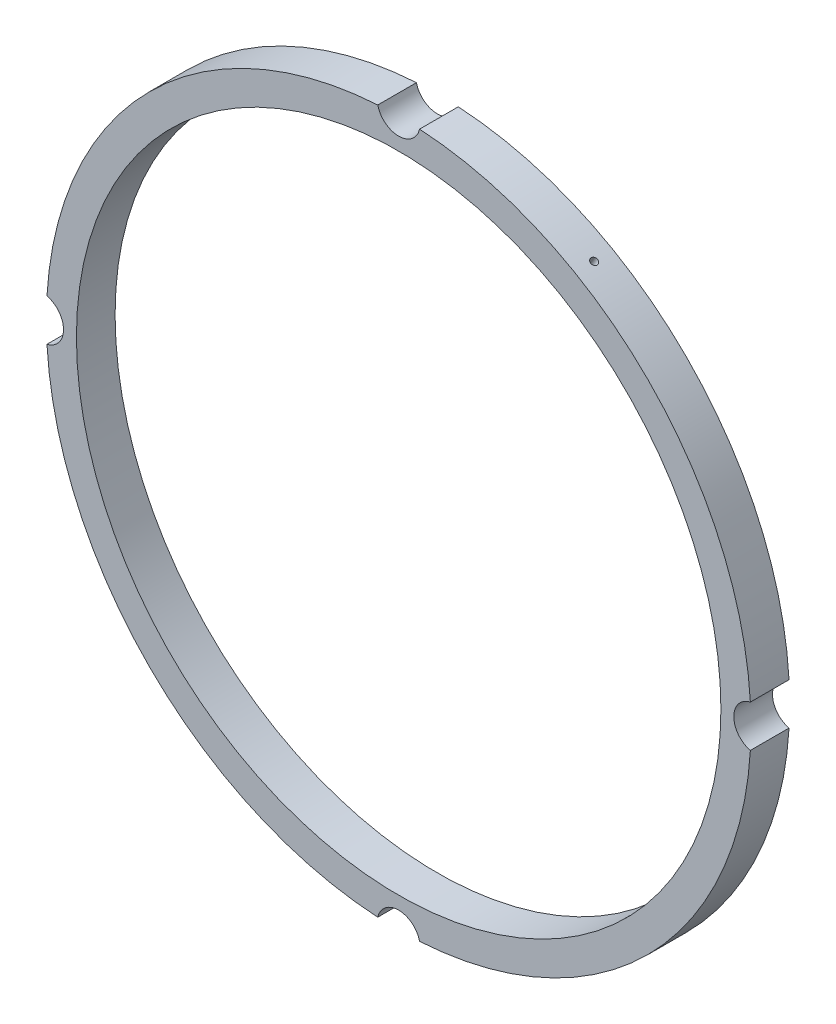
ISO-10303-21;
HEADER;
FILE_DESCRIPTION(('STEP AP214'),'2;1');
FILE_NAME('part.step','',(''),(''),'','','');
FILE_SCHEMA(('AUTOMOTIVE_DESIGN { 1 0 10303 214 1 1 1 1 }'));
ENDSEC;
DATA;
#1=APPLICATION_CONTEXT('core data for automotive mechanical design processes');
#2=APPLICATION_PROTOCOL_DEFINITION('international standard','automotive_design',2000,#1);
#3=PRODUCT_CONTEXT('',#1,'mechanical');
#4=PRODUCT('Part','Part','',(#3));
#5=PRODUCT_RELATED_PRODUCT_CATEGORY('part','',(#4));
#6=PRODUCT_DEFINITION_FORMATION('','',#4);
#7=PRODUCT_DEFINITION_CONTEXT('part definition',#1,'design');
#8=PRODUCT_DEFINITION('design','',#6,#7);
#9=PRODUCT_DEFINITION_SHAPE('','',#8);
#10=(LENGTH_UNIT() NAMED_UNIT(*) SI_UNIT(.MILLI.,.METRE.));
#11=(NAMED_UNIT(*) PLANE_ANGLE_UNIT() SI_UNIT($,.RADIAN.));
#12=(NAMED_UNIT(*) SI_UNIT($,.STERADIAN.) SOLID_ANGLE_UNIT());
#13=UNCERTAINTY_MEASURE_WITH_UNIT(LENGTH_MEASURE(1.E-05),#10,'distance_accuracy_value','');
#14=(GEOMETRIC_REPRESENTATION_CONTEXT(3) GLOBAL_UNCERTAINTY_ASSIGNED_CONTEXT((#13)) GLOBAL_UNIT_ASSIGNED_CONTEXT((#10,
#11,#12)) REPRESENTATION_CONTEXT('',''));
#15=CARTESIAN_POINT('',(0.,0.,0.));
#16=DIRECTION('',(0.,0.,1.));
#17=DIRECTION('',(1.,0.,0.));
#18=AXIS2_PLACEMENT_3D('',#15,#16,#17);
#19=CARTESIAN_POINT('',(0.,0.,9.));
#20=DIRECTION('',(0.,0.,-1.));
#21=DIRECTION('',(-1.,0.,0.));
#22=AXIS2_PLACEMENT_3D('',#19,#20,#21);
#23=CYLINDRICAL_SURFACE('',#22,82.);
#24=CARTESIAN_POINT('',(0.,0.,0.));
#25=DIRECTION('',(0.,0.,1.));
#26=DIRECTION('',(1.,0.,0.));
#27=AXIS2_PLACEMENT_3D('',#24,#25,#26);
#28=CIRCLE('',#27,82.);
#29=CARTESIAN_POINT('',(-4.86723129559619,81.855421686747,0.));
#30=VERTEX_POINT('',#29);
#31=CARTESIAN_POINT('',(-81.8554216867469,4.86723129559705,0.));
#32=VERTEX_POINT('',#31);
#33=EDGE_CURVE('E123',#30,#32,#28,.T.);
#34=ORIENTED_EDGE('',*,*,#33,.T.);
#35=DIRECTION('',(0.,0.,1.));
#36=VECTOR('',#35,1.);
#37=CARTESIAN_POINT('',(-81.8554216867469,4.86723129559704,4.5));
#38=LINE('',#37,#36);
#39=CARTESIAN_POINT('',(-81.8554216867469,4.86723129559704,9.));
#40=VERTEX_POINT('',#39);
#41=EDGE_CURVE('E56',#32,#40,#38,.T.);
#42=ORIENTED_EDGE('',*,*,#41,.T.);
#43=CARTESIAN_POINT('',(0.,0.,9.));
#44=DIRECTION('',(0.,0.,1.));
#45=DIRECTION('',(1.,0.,0.));
#46=AXIS2_PLACEMENT_3D('',#43,#44,#45);
#47=CIRCLE('',#46,82.);
#48=CARTESIAN_POINT('',(-4.86723129559619,81.855421686747,9.));
#49=VERTEX_POINT('',#48);
#50=EDGE_CURVE('E130',#49,#40,#47,.T.);
#51=ORIENTED_EDGE('',*,*,#50,.F.);
#52=DIRECTION('',(0.,0.,1.));
#53=VECTOR('',#52,1.);
#54=CARTESIAN_POINT('',(-4.86723129559619,81.855421686747,4.5));
#55=LINE('',#54,#53);
#56=EDGE_CURVE('E132',#49,#30,#55,.F.);
#57=ORIENTED_EDGE('',*,*,#56,.T.);
#58=EDGE_LOOP('',(#34,#42,#51,#57));
#59=FACE_BOUND('',#58,.T.);
#60=ADVANCED_FACE('F37',(#59),#23,.T.);
#61=CARTESIAN_POINT('',(-81.8554216867471,-4.86723129559533,9.));
#62=VERTEX_POINT('',#61);
#63=CARTESIAN_POINT('',(-4.86723129559619,-81.855421686747,9.));
#64=VERTEX_POINT('',#63);
#65=EDGE_CURVE('E116',#62,#64,#47,.T.);
#66=ORIENTED_EDGE('',*,*,#65,.F.);
#67=DIRECTION('',(0.,0.,1.));
#68=VECTOR('',#67,1.);
#69=CARTESIAN_POINT('',(-81.8554216867471,-4.86723129559533,4.5));
#70=LINE('',#69,#68);
#71=CARTESIAN_POINT('',(-81.8554216867471,-4.86723129559533,0.));
#72=VERTEX_POINT('',#71);
#73=EDGE_CURVE('E107',#62,#72,#70,.F.);
#74=ORIENTED_EDGE('',*,*,#73,.T.);
#75=CARTESIAN_POINT('',(-4.86723129559619,-81.855421686747,0.));
#76=VERTEX_POINT('',#75);
#77=EDGE_CURVE('E64',#72,#76,#28,.T.);
#78=ORIENTED_EDGE('',*,*,#77,.T.);
#79=DIRECTION('',(0.,0.,1.));
#80=VECTOR('',#79,1.);
#81=CARTESIAN_POINT('',(-4.86723129559619,-81.855421686747,4.5));
#82=LINE('',#81,#80);
#83=EDGE_CURVE('E161',#76,#64,#82,.T.);
#84=ORIENTED_EDGE('',*,*,#83,.T.);
#85=EDGE_LOOP('',(#66,#74,#78,#84));
#86=FACE_BOUND('',#85,.T.);
#87=ADVANCED_FACE('F115',(#86),#23,.T.);
#88=CARTESIAN_POINT('',(4.86723129559619,-81.855421686747,9.));
#89=VERTEX_POINT('',#88);
#90=CARTESIAN_POINT('',(81.855421686747,-4.86723129559647,9.));
#91=VERTEX_POINT('',#90);
#92=EDGE_CURVE('E146',#89,#91,#47,.T.);
#93=ORIENTED_EDGE('',*,*,#92,.F.);
#94=DIRECTION('',(0.,0.,1.));
#95=VECTOR('',#94,1.);
#96=CARTESIAN_POINT('',(4.86723129559619,-81.855421686747,4.5));
#97=LINE('',#96,#95);
#98=CARTESIAN_POINT('',(4.86723129559619,-81.855421686747,0.));
#99=VERTEX_POINT('',#98);
#100=EDGE_CURVE('E214',#89,#99,#97,.F.);
#101=ORIENTED_EDGE('',*,*,#100,.T.);
#102=CARTESIAN_POINT('',(81.855421686747,-4.86723129559647,0.));
#103=VERTEX_POINT('',#102);
#104=EDGE_CURVE('E124',#99,#103,#28,.T.);
#105=ORIENTED_EDGE('',*,*,#104,.T.);
#106=DIRECTION('',(0.,0.,1.));
#107=VECTOR('',#106,1.);
#108=CARTESIAN_POINT('',(81.855421686747,-4.86723129559647,4.5));
#109=LINE('',#108,#107);
#110=EDGE_CURVE('E49',#103,#91,#109,.T.);
#111=ORIENTED_EDGE('',*,*,#110,.T.);
#112=EDGE_LOOP('',(#93,#101,#105,#111));
#113=FACE_BOUND('',#112,.T.);
#114=ADVANCED_FACE('F144',(#113),#23,.T.);
#115=CARTESIAN_POINT('',(0.,0.,9.));
#116=DIRECTION('',(0.,0.,1.));
#117=DIRECTION('',(1.,0.,0.));
#118=AXIS2_PLACEMENT_3D('',#115,#116,#117);
#119=PLANE('',#118);
#120=CARTESIAN_POINT('',(-83.,8.6937885337194E-13,9.));
#121=DIRECTION('',(0.,0.,1.));
#122=DIRECTION('',(0.,1.,0.));
#123=AXIS2_PLACEMENT_3D('',#120,#121,#122);
#124=CIRCLE('',#123,5.);
#125=EDGE_CURVE('E112',#62,#40,#124,.T.);
#126=ORIENTED_EDGE('',*,*,#125,.F.);
#127=ORIENTED_EDGE('',*,*,#65,.T.);
#128=CARTESIAN_POINT('',(0.,-83.,9.));
#129=DIRECTION('',(0.,0.,1.));
#130=DIRECTION('',(-1.,0.,0.));
#131=AXIS2_PLACEMENT_3D('',#128,#129,#130);
#132=CIRCLE('',#131,5.);
#133=EDGE_CURVE('E206',#89,#64,#132,.T.);
#134=ORIENTED_EDGE('',*,*,#133,.F.);
#135=ORIENTED_EDGE('',*,*,#92,.T.);
#136=CARTESIAN_POINT('',(83.,-2.8979295112398E-13,9.));
#137=DIRECTION('',(0.,0.,1.));
#138=DIRECTION('',(0.,-1.,0.));
#139=AXIS2_PLACEMENT_3D('',#136,#137,#138);
#140=CIRCLE('',#139,5.);
#141=CARTESIAN_POINT('',(81.855421686747,4.8672312955959,9.));
#142=VERTEX_POINT('',#141);
#143=EDGE_CURVE('E153',#142,#91,#140,.T.);
#144=ORIENTED_EDGE('',*,*,#143,.F.);
#145=CARTESIAN_POINT('',(4.86723129559619,81.855421686747,9.));
#146=VERTEX_POINT('',#145);
#147=EDGE_CURVE('E126',#142,#146,#47,.T.);
#148=ORIENTED_EDGE('',*,*,#147,.T.);
#149=CARTESIAN_POINT('',(0.,83.,9.));
#150=DIRECTION('',(0.,0.,1.));
#151=DIRECTION('',(1.,0.,0.));
#152=AXIS2_PLACEMENT_3D('',#149,#150,#151);
#153=CIRCLE('',#152,5.);
#154=EDGE_CURVE('E156',#49,#146,#153,.T.);
#155=ORIENTED_EDGE('',*,*,#154,.F.);
#156=ORIENTED_EDGE('',*,*,#50,.T.);
#157=EDGE_LOOP('',(#126,#127,#134,#135,#144,#148,#155,#156));
#158=FACE_BOUND('',#157,.T.);
#159=CARTESIAN_POINT('',(0.,0.,9.));
#160=DIRECTION('',(0.,0.,1.));
#161=DIRECTION('',(1.,0.,0.));
#162=AXIS2_PLACEMENT_3D('',#159,#160,#161);
#163=CIRCLE('',#162,75.);
#164=CARTESIAN_POINT('',(75.,0.,9.));
#165=VERTEX_POINT('',#164);
#166=EDGE_CURVE('E168',#165,#165,#163,.T.);
#167=ORIENTED_EDGE('',*,*,#166,.F.);
#168=EDGE_LOOP('',(#167));
#169=FACE_BOUND('',#168,.T.);
#170=ADVANCED_FACE('F202',(#158,#169),#119,.T.);
#171=CARTESIAN_POINT('',(0.,0.,0.));
#172=DIRECTION('',(0.,0.,1.));
#173=DIRECTION('',(1.,0.,0.));
#174=AXIS2_PLACEMENT_3D('',#171,#172,#173);
#175=PLANE('',#174);
#176=ORIENTED_EDGE('',*,*,#77,.F.);
#177=CARTESIAN_POINT('',(-83.,8.6937885337194E-13,0.));
#178=DIRECTION('',(0.,0.,1.));
#179=DIRECTION('',(0.,1.,0.));
#180=AXIS2_PLACEMENT_3D('',#177,#178,#179);
#181=CIRCLE('',#180,5.);
#182=EDGE_CURVE('E105',#72,#32,#181,.T.);
#183=ORIENTED_EDGE('',*,*,#182,.T.);
#184=ORIENTED_EDGE('',*,*,#33,.F.);
#185=CARTESIAN_POINT('',(0.,83.,0.));
#186=DIRECTION('',(0.,0.,1.));
#187=DIRECTION('',(1.,0.,0.));
#188=AXIS2_PLACEMENT_3D('',#185,#186,#187);
#189=CIRCLE('',#188,5.);
#190=CARTESIAN_POINT('',(4.86723129559619,81.855421686747,0.));
#191=VERTEX_POINT('',#190);
#192=EDGE_CURVE('E159',#30,#191,#189,.T.);
#193=ORIENTED_EDGE('',*,*,#192,.T.);
#194=CARTESIAN_POINT('',(81.855421686747,4.8672312955959,0.));
#195=VERTEX_POINT('',#194);
#196=EDGE_CURVE('E127',#195,#191,#28,.T.);
#197=ORIENTED_EDGE('',*,*,#196,.F.);
#198=CARTESIAN_POINT('',(83.,-2.8979295112398E-13,0.));
#199=DIRECTION('',(0.,0.,1.));
#200=DIRECTION('',(0.,-1.,0.));
#201=AXIS2_PLACEMENT_3D('',#198,#199,#200);
#202=CIRCLE('',#201,5.);
#203=EDGE_CURVE('E151',#195,#103,#202,.T.);
#204=ORIENTED_EDGE('',*,*,#203,.T.);
#205=ORIENTED_EDGE('',*,*,#104,.F.);
#206=CARTESIAN_POINT('',(0.,-83.,0.));
#207=DIRECTION('',(0.,0.,1.));
#208=DIRECTION('',(-1.,0.,0.));
#209=AXIS2_PLACEMENT_3D('',#206,#207,#208);
#210=CIRCLE('',#209,5.);
#211=EDGE_CURVE('E122',#99,#76,#210,.T.);
#212=ORIENTED_EDGE('',*,*,#211,.T.);
#213=EDGE_LOOP('',(#176,#183,#184,#193,#197,#204,#205,#212));
#214=FACE_BOUND('',#213,.T.);
#215=CARTESIAN_POINT('',(0.,0.,0.));
#216=DIRECTION('',(0.,0.,1.));
#217=DIRECTION('',(1.,0.,0.));
#218=AXIS2_PLACEMENT_3D('',#215,#216,#217);
#219=CIRCLE('',#218,75.);
#220=CARTESIAN_POINT('',(75.,0.,0.));
#221=VERTEX_POINT('',#220);
#222=EDGE_CURVE('E166',#221,#221,#219,.T.);
#223=ORIENTED_EDGE('',*,*,#222,.T.);
#224=EDGE_LOOP('',(#223));
#225=FACE_BOUND('',#224,.T.);
#226=ADVANCED_FACE('F119',(#214,#225),#175,.F.);
#227=CARTESIAN_POINT('',(40.3052284110281,71.4107034185693,4.5));
#228=CARTESIAN_POINT('',(40.305230162785,71.4107024681233,4.45506479609301));
#229=CARTESIAN_POINT('',(40.3085368078791,71.40883642493,4.41009703714875));
#230=CARTESIAN_POINT('',(40.3216802135916,71.4014156688339,4.32140003350558));
#231=CARTESIAN_POINT('',(40.3315248278901,71.3958565196163,4.2776723443821));
#232=CARTESIAN_POINT('',(40.3574592527584,71.3811999286591,4.19275330768963));
#233=CARTESIAN_POINT('',(40.3735460727166,71.3721041812829,4.1515607564808));
#234=CARTESIAN_POINT('',(40.4114971299767,71.3506227921757,4.07287429083479));
#235=CARTESIAN_POINT('',(40.4333599334488,71.3382379669211,4.03537946164327));
#236=CARTESIAN_POINT('',(40.4822388609424,71.3105120161913,3.96513443541361));
#237=CARTESIAN_POINT('',(40.5092556770344,71.2951704936937,3.93238487660122));
#238=CARTESIAN_POINT('',(40.5676657214676,71.2619507473826,3.87256517048709));
#239=CARTESIAN_POINT('',(40.59905912185,71.2440724238483,3.84549524655357));
#240=CARTESIAN_POINT('',(40.6653214679689,71.2062713712898,3.79780471692709));
#241=CARTESIAN_POINT('',(40.7001904182244,71.1863486396075,3.77718411961991));
#242=CARTESIAN_POINT('',(40.772406334745,71.1450111456782,3.74297779787522));
#243=CARTESIAN_POINT('',(40.8097532955037,71.1235963867468,3.72939205780614));
#244=CARTESIAN_POINT('',(40.8858585322044,71.0798740635081,3.70964144378451));
#245=CARTESIAN_POINT('',(40.9246167652487,71.0575665263361,3.70347634446412));
#246=CARTESIAN_POINT('',(41.0024427076472,71.0126869615936,3.69874133559804));
#247=CARTESIAN_POINT('',(41.0415104163721,70.9901149345609,3.70017141060814));
#248=CARTESIAN_POINT('',(41.1188455717403,70.945348935138,3.71058592631372));
#249=CARTESIAN_POINT('',(41.1571130452983,70.9231549500377,3.71957011251892));
#250=CARTESIAN_POINT('',(41.2317665366884,70.8797805669154,3.7448374350582));
#251=CARTESIAN_POINT('',(41.2681525523058,70.8586001700864,3.76112057998316));
#252=CARTESIAN_POINT('',(41.3380172194721,70.8178647619419,3.80052388209611));
#253=CARTESIAN_POINT('',(41.3714958216182,70.7983097782456,3.82364415543102));
#254=CARTESIAN_POINT('',(41.434603016724,70.7613949232539,3.87606530348475));
#255=CARTESIAN_POINT('',(41.4642316101463,70.7440350516948,3.90536617746084));
#256=CARTESIAN_POINT('',(41.5188083007378,70.7120185025764,3.9693182281911));
#257=CARTESIAN_POINT('',(41.5437562021976,70.6973619380483,4.00396962855131));
#258=CARTESIAN_POINT('',(41.5882710512857,70.6711849340483,4.07763829735254));
#259=CARTESIAN_POINT('',(41.6078379981956,70.6596644949952,4.11665556637643));
#260=CARTESIAN_POINT('',(41.641043626485,70.640100926749,4.19794850712354));
#261=CARTESIAN_POINT('',(41.6546823022913,70.6320578008251,4.24022418191001));
#262=CARTESIAN_POINT('',(41.6756502729947,70.6196879331484,4.3268337992777));
#263=CARTESIAN_POINT('',(41.6829795699621,70.6153611901761,4.37116774118354));
#264=CARTESIAN_POINT('',(41.6911239668386,70.6105530728755,4.46063342804992));
#265=CARTESIAN_POINT('',(41.6919393353669,70.6100715399797,4.50576514003536));
#266=CARTESIAN_POINT('',(41.6870338226723,70.6129677812092,4.59554693556316));
#267=CARTESIAN_POINT('',(41.6813129419862,70.6163455550177,4.64019701914508));
#268=CARTESIAN_POINT('',(41.6634948178797,70.6268596602105,4.72774720890134));
#269=CARTESIAN_POINT('',(41.6513976958952,70.6339959200141,4.77064734838672));
#270=CARTESIAN_POINT('',(41.6211650638207,70.6518147314161,4.8534808607507));
#271=CARTESIAN_POINT('',(41.6030295531477,70.6624972833568,4.89341423334282));
#272=CARTESIAN_POINT('',(41.5612265203059,70.6870924286367,4.96918206255699));
#273=CARTESIAN_POINT('',(41.537558817141,70.7010051276562,5.00501638501377));
#274=CARTESIAN_POINT('',(41.4853544455829,70.7316497769729,5.07156755198845));
#275=CARTESIAN_POINT('',(41.4568177741148,70.7483817290505,5.10228439327472));
#276=CARTESIAN_POINT('',(41.3956750206665,70.7841743762166,5.15772966893016));
#277=CARTESIAN_POINT('',(41.3630688010143,70.8032351500882,5.18245790062276));
#278=CARTESIAN_POINT('',(41.2947046718655,70.8431290267123,5.22522259144113));
#279=CARTESIAN_POINT('',(41.2589467660966,70.8639621273686,5.24325905848161));
#280=CARTESIAN_POINT('',(41.1852880913143,70.9067969831621,5.27212789441348));
#281=CARTESIAN_POINT('',(41.1473873619883,70.9287987166545,5.2829603966825));
#282=CARTESIAN_POINT('',(41.0705139344065,70.9733390629306,5.29711425167829));
#283=CARTESIAN_POINT('',(41.0315412345227,70.9958776765296,5.30043559299621));
#284=CARTESIAN_POINT('',(40.9536306752187,71.0408485140235,5.29947279646204));
#285=CARTESIAN_POINT('',(40.9146928143604,71.0632807424909,5.2951889885238));
#286=CARTESIAN_POINT('',(40.8379572703114,71.1074061241529,5.279138152379));
#287=CARTESIAN_POINT('',(40.8001595894107,71.129099275863,5.26737110914375));
#288=CARTESIAN_POINT('',(40.7267814451327,71.1711392536284,5.23668763250792));
#289=CARTESIAN_POINT('',(40.6912010228659,71.1914860547211,5.21777106659268));
#290=CARTESIAN_POINT('',(40.6232765406942,71.2302669838026,5.17332635454546));
#291=CARTESIAN_POINT('',(40.5909323548439,71.2487011862253,5.14779846584659));
#292=CARTESIAN_POINT('',(40.5304074104666,71.2831487094411,5.09085755066491));
#293=CARTESIAN_POINT('',(40.5022263893502,71.2991621829217,5.05944489564428));
#294=CARTESIAN_POINT('',(40.4508278504761,71.328335198352,4.99161477008843));
#295=CARTESIAN_POINT('',(40.4276115676375,71.3414940302556,4.95519605804873));
#296=CARTESIAN_POINT('',(40.3868099222115,71.3646000206399,4.87838044791628));
#297=CARTESIAN_POINT('',(40.3692273551643,71.3745455846659,4.83798158776967));
#298=CARTESIAN_POINT('',(40.340231691055,71.3909377104108,4.75439747070503));
#299=CARTESIAN_POINT('',(40.3288112020707,71.3973884644812,4.71121562216788));
#300=CARTESIAN_POINT('',(40.3155112248783,71.4048988976244,4.63979902324665));
#301=CARTESIAN_POINT('',(40.3116600520628,71.4070729879977,4.61202827082364));
#302=CARTESIAN_POINT('',(40.3065180975612,71.4099755455663,4.55617592082972));
#303=CARTESIAN_POINT('',(40.3052273157971,71.4107040128057,4.52809432326828));
#304=CARTESIAN_POINT('',(40.3052284110281,71.4107034185693,4.5));
#305=B_SPLINE_CURVE_WITH_KNOTS('',3,(#227,#228,#229,#230,#231,#232,#233,#234,#235,#236,#237,
#238,#239,#240,#241,#242,#243,#244,#245,#246,#247,#248,#249,#250,#251,#252,#253,#254,#255,#256,
#257,#258,#259,#260,#261,#262,#263,#264,#265,#266,#267,#268,#269,#270,#271,#272,#273,#274,#275,
#276,#277,#278,#279,#280,#281,#282,#283,#284,#285,#286,#287,#288,#289,#290,#291,#292,#293,#294,
#295,#296,#297,#298,#299,#300,#301,#302,#303,#304),.UNSPECIFIED.,.T.,.F.,(4,2,2,2,2,2,2,2,2,2,2,
2,2,2,2,2,2,2,2,2,2,2,2,2,2,2,2,2,2,2,2,2,2,2,2,2,2,2,4),(0.,0.134703067123949,
0.269568238553242,0.404368876326949,0.539136082591835,0.673921397882167,0.808712013005293,
0.94350280339,1.07829329426615,1.21307969139774,1.3478658144514,1.4826473968801,
1.61742913794746,1.75221316877516,1.88699718340582,2.02178683237555,2.15657649934034,
2.29136629302324,2.426156042478,2.56094023348925,2.69572441343266,2.83050602649563,
2.96528765257389,3.10007368890393,3.23485981034963,3.36965049281604,3.50444101585779,
3.639229043254,3.77401727538222,3.90879966049609,4.04358231629638,4.1783674703827,
4.31314737696436,4.44791877874285,4.58272366439784,4.71759533917825,4.85230486249334,
4.93652372208243,5.02074257910246),.UNSPECIFIED.);
#306=CARTESIAN_POINT('',(40.3052284110281,71.4107034185693,4.5));
#307=VERTEX_POINT('',#306);
#308=EDGE_CURVE('E11',#307,#307,#305,.T.);
#309=ORIENTED_EDGE('',*,*,#308,.T.);
#310=EDGE_LOOP('',(#309));
#311=FACE_BOUND('',#310,.T.);
#312=ORIENTED_EDGE('',*,*,#147,.F.);
#313=DIRECTION('',(0.,0.,1.));
#314=VECTOR('',#313,1.);
#315=CARTESIAN_POINT('',(81.855421686747,4.8672312955959,4.5));
#316=LINE('',#315,#314);
#317=EDGE_CURVE('E138',#142,#195,#316,.F.);
#318=ORIENTED_EDGE('',*,*,#317,.T.);
#319=ORIENTED_EDGE('',*,*,#196,.T.);
#320=DIRECTION('',(0.,0.,1.));
#321=VECTOR('',#320,1.);
#322=CARTESIAN_POINT('',(4.86723129559619,81.855421686747,4.5));
#323=LINE('',#322,#321);
#324=EDGE_CURVE('E135',#191,#146,#323,.T.);
#325=ORIENTED_EDGE('',*,*,#324,.T.);
#326=EDGE_LOOP('',(#312,#318,#319,#325));
#327=FACE_BOUND('',#326,.T.);
#328=ADVANCED_FACE('F39',(#311,#327),#23,.T.);
#329=CARTESIAN_POINT('',(0.,0.,9.));
#330=DIRECTION('',(0.,0.,-1.));
#331=DIRECTION('',(-1.,0.,0.));
#332=AXIS2_PLACEMENT_3D('',#329,#330,#331);
#333=CYLINDRICAL_SURFACE('',#332,75.);
#334=CARTESIAN_POINT('',(36.8050462829542,65.3482101370007,4.5));
#335=CARTESIAN_POINT('',(36.8050480371068,65.3482091908556,4.4550650202504));
#336=CARTESIAN_POINT('',(36.8083563893281,65.3463461799556,4.41009749094247));
#337=CARTESIAN_POINT('',(36.8215064307599,65.3389372344705,4.32140095562176));
#338=CARTESIAN_POINT('',(36.8313559762903,65.3333868711768,4.2776735049402));
#339=CARTESIAN_POINT('',(36.8573029001601,65.3187526175866,4.19275494634586));
#340=CARTESIAN_POINT('',(36.8733972851322,65.3096704202157,4.15156263419737));
#341=CARTESIAN_POINT('',(36.9113652327449,65.2882193796654,4.07287659923404));
#342=CARTESIAN_POINT('',(36.9332373616623,65.275851351847,4.03538196202201));
#343=CARTESIAN_POINT('',(36.9821357786632,65.2481602840425,3.96513702906339));
#344=CARTESIAN_POINT('',(37.0091627888349,65.2328368300614,3.93238739912278));
#345=CARTESIAN_POINT('',(37.0675928290538,65.1996525164563,3.87256749931847));
#346=CARTESIAN_POINT('',(37.0989960311762,65.1817915570551,3.84549745288538));
#347=CARTESIAN_POINT('',(37.165276621277,65.1440224914367,3.79780653018475));
#348=CARTESIAN_POINT('',(37.2001540272983,65.1241143745878,3.77718568741294));
#349=CARTESIAN_POINT('',(37.2723844475244,65.0828017747338,3.74297889347224));
#350=CARTESIAN_POINT('',(37.309737456126,65.0613972951156,3.7293929263815));
#351=CARTESIAN_POINT('',(37.385851456047,65.0176901750221,3.7096419663105));
#352=CARTESIAN_POINT('',(37.4246123956756,64.9953875675174,3.70347670116969));
#353=CARTESIAN_POINT('',(37.5024403148383,64.9505118372576,3.69874132894007));
#354=CARTESIAN_POINT('',(37.541507293736,64.9279387150649,3.70017120606366));
#355=CARTESIAN_POINT('',(37.6188373554944,64.8831647861721,3.71058526118988));
#356=CARTESIAN_POINT('',(37.6571004707224,64.8609639644887,3.71956913443268));
#357=CARTESIAN_POINT('',(37.7317423544195,64.8175707954564,3.74483569725782));
#358=CARTESIAN_POINT('',(37.7681211206258,64.7963784493184,3.76111839560382));
#359=CARTESIAN_POINT('',(37.8379693340923,64.7556153066755,3.8005207415664));
#360=CARTESIAN_POINT('',(37.8714387220741,64.7360445432105,3.82364052844561));
#361=CARTESIAN_POINT('',(37.934526459754,64.6990961367939,3.87606063773741));
#362=CARTESIAN_POINT('',(37.9641448097006,64.6817184937006,3.90536095975093));
#363=CARTESIAN_POINT('',(38.0187013917973,64.6496662631315,3.96931214094038));
#364=CARTESIAN_POINT('',(38.0436393901331,64.6349918106984,4.00396326726652));
#365=CARTESIAN_POINT('',(38.0881356631969,64.6087810653332,4.07763147675293));
#366=CARTESIAN_POINT('',(38.1076939372037,64.597244772822,4.11664856049856));
#367=CARTESIAN_POINT('',(38.1408844541449,64.5776533045459,4.19794124937333));
#368=CARTESIAN_POINT('',(38.1545166903565,64.5695981327303,4.24021685819907));
#369=CARTESIAN_POINT('',(38.1754747513236,64.5572093338679,4.32682645392057));
#370=CARTESIAN_POINT('',(38.1828005784973,64.5528757053942,4.37116044002703));
#371=CARTESIAN_POINT('',(38.1909413824111,64.5480597632868,4.46062594210085));
#372=CARTESIAN_POINT('',(38.1917566800836,64.5475772598144,4.50575741864649));
#373=CARTESIAN_POINT('',(38.1868545475179,64.5504775161813,4.59553881341012));
#374=CARTESIAN_POINT('',(38.1811371179785,64.5538602756073,4.64018873167963));
#375=CARTESIAN_POINT('',(38.1633291083601,64.5643896994272,4.72773849669129));
#376=CARTESIAN_POINT('',(38.1512386734367,64.5715362780939,4.77063838326932));
#377=CARTESIAN_POINT('',(38.121021943817,64.58937987047,4.85347150366393));
#378=CARTESIAN_POINT('',(38.1028956482698,64.6000768846797,4.89340473706235));
#379=CARTESIAN_POINT('',(38.0611124544012,64.6247035165116,4.96917268708774));
#380=CARTESIAN_POINT('',(38.0374553396379,64.6386332606425,5.00500724323626));
#381=CARTESIAN_POINT('',(37.9852724588776,64.6693125821188,5.07155900623287));
#382=CARTESIAN_POINT('',(37.9567466895903,64.6860621613697,5.10227620962268));
#383=CARTESIAN_POINT('',(37.8956246465006,64.7218887639563,5.15772253126949));
#384=CARTESIAN_POINT('',(37.863028208343,64.7409658812668,5.18245140762659));
#385=CARTESIAN_POINT('',(37.7946816007971,64.7808892105927,5.22521742401462));
#386=CARTESIAN_POINT('',(37.7589314352171,64.8017354204719,5.24325457212629));
#387=CARTESIAN_POINT('',(37.6852854659991,64.8445917012878,5.27212471767835));
#388=CARTESIAN_POINT('',(37.6473897097049,64.8666017465431,5.28295787401225));
#389=CARTESIAN_POINT('',(37.570522798859,64.9111530416104,5.29711304961451));
#390=CARTESIAN_POINT('',(37.5315516427333,64.9336942922,5.30043505788945));
#391=CARTESIAN_POINT('',(37.4536409057876,64.9786642363913,5.29947358692461));
#392=CARTESIAN_POINT('',(37.4147013234452,65.0010929357281,5.29519049922343));
#393=CARTESIAN_POINT('',(37.3379589704716,65.0452056620496,5.27914120179627));
#394=CARTESIAN_POINT('',(37.3001562021231,65.0668896875391,5.26737497704568));
#395=CARTESIAN_POINT('',(37.2267650922114,65.1089068431069,5.23669322600969));
#396=CARTESIAN_POINT('',(37.1911767916611,65.1292399481661,5.21777756735918));
#397=CARTESIAN_POINT('',(37.1232346218809,65.1679904761977,5.17333473728467));
#398=CARTESIAN_POINT('',(37.0908806269882,65.1864079735984,5.14780782286669));
#399=CARTESIAN_POINT('',(37.0303349483126,65.2208211267837,5.09086865031062));
#400=CARTESIAN_POINT('',(37.0021430357465,65.236816915687,5.05945671587823));
#401=CARTESIAN_POINT('',(36.9507230753817,65.2659554454819,4.99162792346798));
#402=CARTESIAN_POINT('',(36.9274962624952,65.2790974766038,4.95520982405612));
#403=CARTESIAN_POINT('',(36.886674973326,65.3021727146869,4.87839515111329));
#404=CARTESIAN_POINT('',(36.8690833131314,65.3121043173042,4.8379966015531));
#405=CARTESIAN_POINT('',(36.8400719807352,65.3284729390554,4.75441290469289));
#406=CARTESIAN_POINT('',(36.8286449144051,65.3349141447912,4.71123116563503));
#407=CARTESIAN_POINT('',(36.8153363830033,65.3424137824977,4.63981210935176));
#408=CARTESIAN_POINT('',(36.8114824882576,65.3445848245014,4.61203879602761));
#409=CARTESIAN_POINT('',(36.8063368898609,65.3474832975298,4.55618123049377));
#410=CARTESIAN_POINT('',(36.8050451861163,65.3482107286071,4.52809697829542));
#411=CARTESIAN_POINT('',(36.8050462829542,65.3482101370007,4.5));
#412=B_SPLINE_CURVE_WITH_KNOTS('',3,(#334,#335,#336,#337,#338,#339,#340,#341,#342,#343,#344,
#345,#346,#347,#348,#349,#350,#351,#352,#353,#354,#355,#356,#357,#358,#359,#360,#361,#362,#363,
#364,#365,#366,#367,#368,#369,#370,#371,#372,#373,#374,#375,#376,#377,#378,#379,#380,#381,#382,
#383,#384,#385,#386,#387,#388,#389,#390,#391,#392,#393,#394,#395,#396,#397,#398,#399,#400,#401,
#402,#403,#404,#405,#406,#407,#408,#409,#410,#411),.UNSPECIFIED.,.T.,.F.,(4,2,2,2,2,2,2,2,2,2,2,
2,2,2,2,2,2,2,2,2,2,2,2,2,2,2,2,2,2,2,2,2,2,2,2,2,2,2,4),(0.,0.134702384884242,0.26956684777131,
0.404366745160628,0.539133223883875,0.673918594382308,0.808709266243899,0.943500638166857,
1.0782917050187,1.21307782814301,1.34786367109515,1.48264407648282,1.61742464370114,
1.7522079564138,1.88699126042392,2.02178129595246,2.15657134955317,2.29136155606752,
2.42615171089689,2.56093522128892,2.69571871726381,2.83049914345482,2.96527958864288,
3.10006530918112,3.2348511208066,3.36964237622912,3.50443346888079,3.63922158843893,
3.77400990527479,3.9087912829084,4.04357293115624,4.17835707488293,4.31313597979598,
4.44790747336682,4.58271244820656,4.71758468521551,4.8522947878496,4.9365216005377,
5.02074841015292),.UNSPECIFIED.);
#413=CARTESIAN_POINT('',(36.8050462829542,65.3482101370007,4.5));
#414=VERTEX_POINT('',#413);
#415=EDGE_CURVE('E207',#414,#414,#412,.T.);
#416=ORIENTED_EDGE('',*,*,#415,.F.);
#417=EDGE_LOOP('',(#416));
#418=FACE_BOUND('',#417,.T.);
#419=ORIENTED_EDGE('',*,*,#166,.T.);
#420=EDGE_LOOP('',(#419));
#421=FACE_BOUND('',#420,.T.);
#422=ORIENTED_EDGE('',*,*,#222,.F.);
#423=EDGE_LOOP('',(#422));
#424=FACE_BOUND('',#423,.T.);
#425=ADVANCED_FACE('F173',(#418,#421,#424),#333,.F.);
#426=CARTESIAN_POINT('',(0.,83.,0.));
#427=DIRECTION('',(0.,0.,1.));
#428=DIRECTION('',(1.,0.,0.));
#429=AXIS2_PLACEMENT_3D('',#426,#427,#428);
#430=CYLINDRICAL_SURFACE('',#429,5.);
#431=ORIENTED_EDGE('',*,*,#192,.F.);
#432=ORIENTED_EDGE('',*,*,#56,.F.);
#433=ORIENTED_EDGE('',*,*,#154,.T.);
#434=ORIENTED_EDGE('',*,*,#324,.F.);
#435=EDGE_LOOP('',(#431,#432,#433,#434));
#436=FACE_BOUND('',#435,.T.);
#437=ADVANCED_FACE('F175',(#436),#430,.F.);
#438=CARTESIAN_POINT('',(83.,-2.8979295112398E-13,0.));
#439=DIRECTION('',(0.,0.,1.));
#440=DIRECTION('',(1.,0.,0.));
#441=AXIS2_PLACEMENT_3D('',#438,#439,#440);
#442=CYLINDRICAL_SURFACE('',#441,5.);
#443=ORIENTED_EDGE('',*,*,#203,.F.);
#444=ORIENTED_EDGE('',*,*,#317,.F.);
#445=ORIENTED_EDGE('',*,*,#143,.T.);
#446=ORIENTED_EDGE('',*,*,#110,.F.);
#447=EDGE_LOOP('',(#443,#444,#445,#446));
#448=FACE_BOUND('',#447,.T.);
#449=ADVANCED_FACE('F150',(#448),#442,.F.);
#450=CARTESIAN_POINT('',(0.,-83.,0.));
#451=DIRECTION('',(0.,0.,1.));
#452=DIRECTION('',(1.,0.,0.));
#453=AXIS2_PLACEMENT_3D('',#450,#451,#452);
#454=CYLINDRICAL_SURFACE('',#453,5.);
#455=ORIENTED_EDGE('',*,*,#211,.F.);
#456=ORIENTED_EDGE('',*,*,#100,.F.);
#457=ORIENTED_EDGE('',*,*,#133,.T.);
#458=ORIENTED_EDGE('',*,*,#83,.F.);
#459=EDGE_LOOP('',(#455,#456,#457,#458));
#460=FACE_BOUND('',#459,.T.);
#461=ADVANCED_FACE('F216',(#460),#454,.F.);
#462=CARTESIAN_POINT('',(-83.,8.6937885337194E-13,0.));
#463=DIRECTION('',(0.,0.,1.));
#464=DIRECTION('',(1.,0.,0.));
#465=AXIS2_PLACEMENT_3D('',#462,#463,#464);
#466=CYLINDRICAL_SURFACE('',#465,5.);
#467=ORIENTED_EDGE('',*,*,#182,.F.);
#468=ORIENTED_EDGE('',*,*,#73,.F.);
#469=ORIENTED_EDGE('',*,*,#125,.T.);
#470=ORIENTED_EDGE('',*,*,#41,.F.);
#471=EDGE_LOOP('',(#467,#468,#469,#470));
#472=FACE_BOUND('',#471,.T.);
#473=ADVANCED_FACE('F106',(#472),#466,.F.);
#474=CARTESIAN_POINT('',(41.,71.014083110324,4.5));
#475=DIRECTION('',(0.5,0.866025403784439,0.));
#476=DIRECTION('',(-0.866025403784439,0.5,0.));
#477=AXIS2_PLACEMENT_3D('',#474,#475,#476);
#478=CYLINDRICAL_SURFACE('',#477,0.799999999999989);
#479=ORIENTED_EDGE('',*,*,#415,.T.);
#480=EDGE_LOOP('',(#479));
#481=FACE_BOUND('',#480,.T.);
#482=ORIENTED_EDGE('',*,*,#308,.F.);
#483=EDGE_LOOP('',(#482));
#484=FACE_BOUND('',#483,.T.);
#485=ADVANCED_FACE('F223',(#481,#484),#478,.F.);
#486=CLOSED_SHELL('',(#60,#87,#114,#170,#226,#328,#425,#437,#449,#461,#473,#485));
#487=MANIFOLD_SOLID_BREP('B2',#486);
#488=ADVANCED_BREP_SHAPE_REPRESENTATION('',(#18,#487),#14);
#489=SHAPE_DEFINITION_REPRESENTATION(#9,#488);
ENDSEC;
END-ISO-10303-21;
